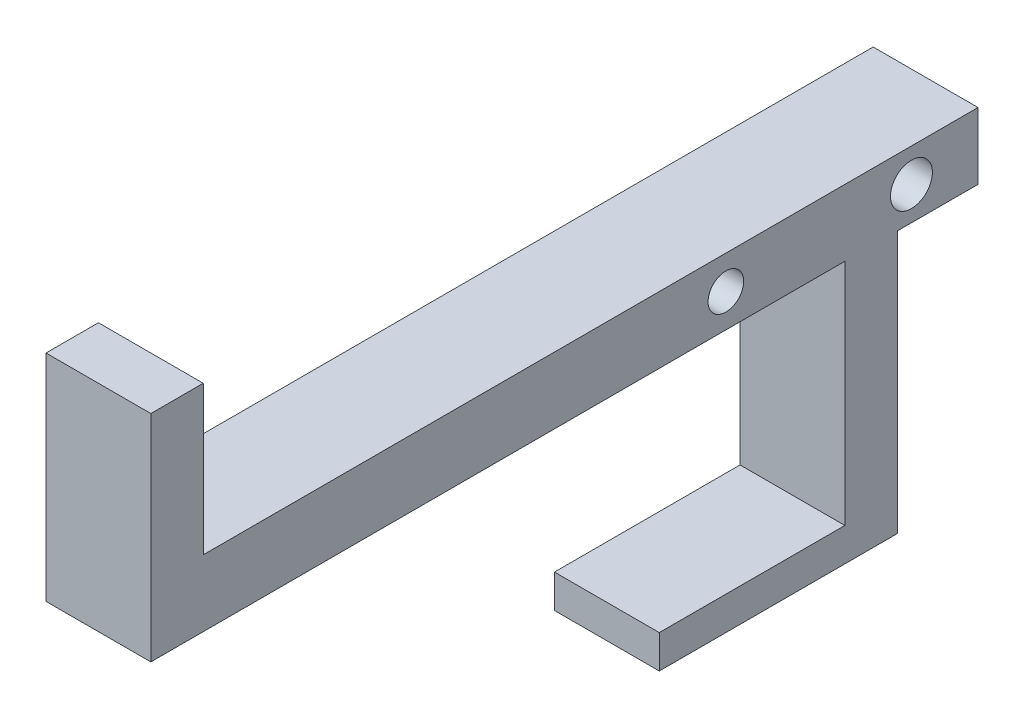
ISO-10303-21;
HEADER;
FILE_DESCRIPTION(('STEP AP214'),'2;1');
FILE_NAME('part.step','',(''),(''),'','','');
FILE_SCHEMA(('AUTOMOTIVE_DESIGN { 1 0 10303 214 1 1 1 1 }'));
ENDSEC;
DATA;
#1=APPLICATION_CONTEXT('core data for automotive mechanical design processes');
#2=APPLICATION_PROTOCOL_DEFINITION('international standard','automotive_design',2000,#1);
#3=PRODUCT_CONTEXT('',#1,'mechanical');
#4=PRODUCT('Part','Part','',(#3));
#5=PRODUCT_RELATED_PRODUCT_CATEGORY('part','',(#4));
#6=PRODUCT_DEFINITION_FORMATION('','',#4);
#7=PRODUCT_DEFINITION_CONTEXT('part definition',#1,'design');
#8=PRODUCT_DEFINITION('design','',#6,#7);
#9=PRODUCT_DEFINITION_SHAPE('','',#8);
#10=(LENGTH_UNIT() NAMED_UNIT(*) SI_UNIT(.MILLI.,.METRE.));
#11=(NAMED_UNIT(*) PLANE_ANGLE_UNIT() SI_UNIT($,.RADIAN.));
#12=(NAMED_UNIT(*) SI_UNIT($,.STERADIAN.) SOLID_ANGLE_UNIT());
#13=UNCERTAINTY_MEASURE_WITH_UNIT(LENGTH_MEASURE(1.E-05),#10,'distance_accuracy_value','');
#14=(GEOMETRIC_REPRESENTATION_CONTEXT(3) GLOBAL_UNCERTAINTY_ASSIGNED_CONTEXT((#13)) GLOBAL_UNIT_ASSIGNED_CONTEXT((#10,
#11,#12)) REPRESENTATION_CONTEXT('',''));
#15=CARTESIAN_POINT('',(0.,0.,0.));
#16=DIRECTION('',(0.,0.,1.));
#17=DIRECTION('',(1.,0.,0.));
#18=AXIS2_PLACEMENT_3D('',#15,#16,#17);
#19=CARTESIAN_POINT('',(10.,0.,-17.7));
#20=DIRECTION('',(0.,0.,-1.));
#21=DIRECTION('',(-1.,0.,0.));
#22=AXIS2_PLACEMENT_3D('',#19,#20,#21);
#23=PLANE('',#22);
#24=DIRECTION('',(0.,-1.,0.));
#25=VECTOR('',#24,1.);
#26=CARTESIAN_POINT('',(0.,0.,-17.7));
#27=LINE('',#26,#25);
#28=CARTESIAN_POINT('',(0.,28.175,-17.7));
#29=VERTEX_POINT('',#28);
#30=CARTESIAN_POINT('',(0.,21.825,-17.7));
#31=VERTEX_POINT('',#30);
#32=EDGE_CURVE('E160',#29,#31,#27,.T.);
#33=ORIENTED_EDGE('',*,*,#32,.F.);
#34=DIRECTION('',(-1.,0.,0.));
#35=VECTOR('',#34,1.);
#36=CARTESIAN_POINT('',(10.,28.175,-17.7));
#37=LINE('',#36,#35);
#38=CARTESIAN_POINT('',(10.,28.175,-17.7));
#39=VERTEX_POINT('',#38);
#40=EDGE_CURVE('E11',#39,#29,#37,.T.);
#41=ORIENTED_EDGE('',*,*,#40,.F.);
#42=DIRECTION('',(0.,-1.,0.));
#43=VECTOR('',#42,1.);
#44=CARTESIAN_POINT('',(10.,0.,-17.7));
#45=LINE('',#44,#43);
#46=CARTESIAN_POINT('',(10.,21.825,-17.7));
#47=VERTEX_POINT('',#46);
#48=EDGE_CURVE('E236',#39,#47,#45,.T.);
#49=ORIENTED_EDGE('',*,*,#48,.T.);
#50=DIRECTION('',(-1.,0.,0.));
#51=VECTOR('',#50,1.);
#52=CARTESIAN_POINT('',(10.,21.825,-17.7));
#53=LINE('',#52,#51);
#54=EDGE_CURVE('E52',#47,#31,#53,.T.);
#55=ORIENTED_EDGE('',*,*,#54,.T.);
#56=EDGE_LOOP('',(#33,#41,#49,#55));
#57=FACE_BOUND('',#56,.T.);
#58=ADVANCED_FACE('F35',(#57),#23,.T.);
#59=CARTESIAN_POINT('',(10.,28.175,0.));
#60=DIRECTION('',(0.,1.,0.));
#61=DIRECTION('',(0.,0.,1.));
#62=AXIS2_PLACEMENT_3D('',#59,#60,#61);
#63=PLANE('',#62);
#64=DIRECTION('',(0.,0.,-1.));
#65=VECTOR('',#64,1.);
#66=CARTESIAN_POINT('',(0.,28.175,0.));
#67=LINE('',#66,#65);
#68=CARTESIAN_POINT('',(0.,28.175,56.2));
#69=VERTEX_POINT('',#68);
#70=EDGE_CURVE('E162',#69,#29,#67,.T.);
#71=ORIENTED_EDGE('',*,*,#70,.F.);
#72=DIRECTION('',(-1.,0.,0.));
#73=VECTOR('',#72,1.);
#74=CARTESIAN_POINT('',(10.,28.175,56.2));
#75=LINE('',#74,#73);
#76=CARTESIAN_POINT('',(10.,28.175,56.2));
#77=VERTEX_POINT('',#76);
#78=EDGE_CURVE('E44',#77,#69,#75,.T.);
#79=ORIENTED_EDGE('',*,*,#78,.F.);
#80=DIRECTION('',(0.,0.,-1.));
#81=VECTOR('',#80,1.);
#82=CARTESIAN_POINT('',(10.,28.175,0.));
#83=LINE('',#82,#81);
#84=EDGE_CURVE('E232',#77,#39,#83,.T.);
#85=ORIENTED_EDGE('',*,*,#84,.T.);
#86=ORIENTED_EDGE('',*,*,#40,.T.);
#87=EDGE_LOOP('',(#71,#79,#85,#86));
#88=FACE_BOUND('',#87,.T.);
#89=ADVANCED_FACE('F220',(#88),#63,.T.);
#90=CARTESIAN_POINT('',(10.,0.,56.2));
#91=DIRECTION('',(0.,0.,-1.));
#92=DIRECTION('',(-1.,0.,0.));
#93=AXIS2_PLACEMENT_3D('',#90,#91,#92);
#94=PLANE('',#93);
#95=DIRECTION('',(0.,-1.,0.));
#96=VECTOR('',#95,1.);
#97=CARTESIAN_POINT('',(0.,0.,56.2));
#98=LINE('',#97,#96);
#99=CARTESIAN_POINT('',(0.,42.3460380599092,56.2));
#100=VERTEX_POINT('',#99);
#101=EDGE_CURVE('E165',#100,#69,#98,.T.);
#102=ORIENTED_EDGE('',*,*,#101,.F.);
#103=DIRECTION('',(-1.,0.,0.));
#104=VECTOR('',#103,1.);
#105=CARTESIAN_POINT('',(10.,42.3460380599092,56.2));
#106=LINE('',#105,#104);
#107=CARTESIAN_POINT('',(10.,42.3460380599092,56.2));
#108=VERTEX_POINT('',#107);
#109=EDGE_CURVE('E209',#108,#100,#106,.T.);
#110=ORIENTED_EDGE('',*,*,#109,.F.);
#111=DIRECTION('',(0.,-1.,0.));
#112=VECTOR('',#111,1.);
#113=CARTESIAN_POINT('',(10.,0.,56.2));
#114=LINE('',#113,#112);
#115=EDGE_CURVE('E216',#108,#77,#114,.T.);
#116=ORIENTED_EDGE('',*,*,#115,.T.);
#117=ORIENTED_EDGE('',*,*,#78,.T.);
#118=EDGE_LOOP('',(#102,#110,#116,#117));
#119=FACE_BOUND('',#118,.T.);
#120=ADVANCED_FACE('F214',(#119),#94,.T.);
#121=CARTESIAN_POINT('',(10.,42.3460380599092,0.));
#122=DIRECTION('',(0.,1.,0.));
#123=DIRECTION('',(0.,0.,1.));
#124=AXIS2_PLACEMENT_3D('',#121,#122,#123);
#125=PLANE('',#124);
#126=DIRECTION('',(0.,0.,-1.));
#127=VECTOR('',#126,1.);
#128=CARTESIAN_POINT('',(0.,42.3460380599092,0.));
#129=LINE('',#128,#127);
#130=CARTESIAN_POINT('',(0.,42.3460380599092,61.2));
#131=VERTEX_POINT('',#130);
#132=EDGE_CURVE('E168',#131,#100,#129,.T.);
#133=ORIENTED_EDGE('',*,*,#132,.F.);
#134=DIRECTION('',(-1.,0.,0.));
#135=VECTOR('',#134,1.);
#136=CARTESIAN_POINT('',(10.,42.3460380599092,61.2));
#137=LINE('',#136,#135);
#138=CARTESIAN_POINT('',(10.,42.3460380599092,61.2));
#139=VERTEX_POINT('',#138);
#140=EDGE_CURVE('E207',#139,#131,#137,.T.);
#141=ORIENTED_EDGE('',*,*,#140,.F.);
#142=DIRECTION('',(0.,0.,-1.));
#143=VECTOR('',#142,1.);
#144=CARTESIAN_POINT('',(10.,42.3460380599092,0.));
#145=LINE('',#144,#143);
#146=EDGE_CURVE('E231',#139,#108,#145,.T.);
#147=ORIENTED_EDGE('',*,*,#146,.T.);
#148=ORIENTED_EDGE('',*,*,#109,.T.);
#149=EDGE_LOOP('',(#133,#141,#147,#148));
#150=FACE_BOUND('',#149,.T.);
#151=ADVANCED_FACE('F227',(#150),#125,.T.);
#152=CARTESIAN_POINT('',(10.,0.,61.2));
#153=DIRECTION('',(0.,0.,-1.));
#154=DIRECTION('',(-1.,0.,0.));
#155=AXIS2_PLACEMENT_3D('',#152,#153,#154);
#156=PLANE('',#155);
#157=DIRECTION('',(0.,-1.,0.));
#158=VECTOR('',#157,1.);
#159=CARTESIAN_POINT('',(0.,0.,61.2));
#160=LINE('',#159,#158);
#161=CARTESIAN_POINT('',(0.,21.825,61.2));
#162=VERTEX_POINT('',#161);
#163=EDGE_CURVE('E171',#131,#162,#160,.T.);
#164=ORIENTED_EDGE('',*,*,#163,.T.);
#165=DIRECTION('',(-1.,0.,0.));
#166=VECTOR('',#165,1.);
#167=CARTESIAN_POINT('',(10.,21.825,61.2));
#168=LINE('',#167,#166);
#169=CARTESIAN_POINT('',(10.,21.825,61.2));
#170=VERTEX_POINT('',#169);
#171=EDGE_CURVE('E205',#170,#162,#168,.T.);
#172=ORIENTED_EDGE('',*,*,#171,.F.);
#173=DIRECTION('',(0.,-1.,0.));
#174=VECTOR('',#173,1.);
#175=CARTESIAN_POINT('',(10.,0.,61.2));
#176=LINE('',#175,#174);
#177=EDGE_CURVE('E234',#139,#170,#176,.T.);
#178=ORIENTED_EDGE('',*,*,#177,.F.);
#179=ORIENTED_EDGE('',*,*,#140,.T.);
#180=EDGE_LOOP('',(#164,#172,#178,#179));
#181=FACE_BOUND('',#180,.T.);
#182=ADVANCED_FACE('F273',(#181),#156,.F.);
#183=CARTESIAN_POINT('',(10.,21.825,0.));
#184=DIRECTION('',(0.,-1.,0.));
#185=DIRECTION('',(0.,0.,-1.));
#186=AXIS2_PLACEMENT_3D('',#183,#184,#185);
#187=PLANE('',#186);
#188=DIRECTION('',(0.,0.,1.));
#189=VECTOR('',#188,1.);
#190=CARTESIAN_POINT('',(0.,21.825,0.));
#191=LINE('',#190,#189);
#192=CARTESIAN_POINT('',(0.,21.825,-5.));
#193=VERTEX_POINT('',#192);
#194=EDGE_CURVE('E174',#193,#162,#191,.T.);
#195=ORIENTED_EDGE('',*,*,#194,.F.);
#196=DIRECTION('',(-1.,0.,0.));
#197=VECTOR('',#196,1.);
#198=CARTESIAN_POINT('',(10.,21.825,-5.));
#199=LINE('',#198,#197);
#200=CARTESIAN_POINT('',(10.,21.825,-5.));
#201=VERTEX_POINT('',#200);
#202=EDGE_CURVE('E203',#201,#193,#199,.T.);
#203=ORIENTED_EDGE('',*,*,#202,.F.);
#204=DIRECTION('',(0.,0.,1.));
#205=VECTOR('',#204,1.);
#206=CARTESIAN_POINT('',(10.,21.825,0.));
#207=LINE('',#206,#205);
#208=EDGE_CURVE('E241',#201,#170,#207,.T.);
#209=ORIENTED_EDGE('',*,*,#208,.T.);
#210=ORIENTED_EDGE('',*,*,#171,.T.);
#211=EDGE_LOOP('',(#195,#203,#209,#210));
#212=FACE_BOUND('',#211,.T.);
#213=ADVANCED_FACE('F276',(#212),#187,.T.);
#214=CARTESIAN_POINT('',(10.,0.,-5.));
#215=DIRECTION('',(0.,0.,-1.));
#216=DIRECTION('',(0.,1.,0.));
#217=AXIS2_PLACEMENT_3D('',#214,#215,#216);
#218=PLANE('',#217);
#219=DIRECTION('',(0.,-1.,0.));
#220=VECTOR('',#219,1.);
#221=CARTESIAN_POINT('',(0.,0.,-5.));
#222=LINE('',#221,#220);
#223=CARTESIAN_POINT('',(0.,0.,-5.));
#224=VERTEX_POINT('',#223);
#225=EDGE_CURVE('E177',#193,#224,#222,.T.);
#226=ORIENTED_EDGE('',*,*,#225,.T.);
#227=DIRECTION('',(-1.,0.,0.));
#228=VECTOR('',#227,1.);
#229=CARTESIAN_POINT('',(10.,0.,-5.));
#230=LINE('',#229,#228);
#231=CARTESIAN_POINT('',(10.,0.,-5.));
#232=VERTEX_POINT('',#231);
#233=EDGE_CURVE('E201',#232,#224,#230,.T.);
#234=ORIENTED_EDGE('',*,*,#233,.F.);
#235=DIRECTION('',(0.,-1.,0.));
#236=VECTOR('',#235,1.);
#237=CARTESIAN_POINT('',(10.,0.,-5.));
#238=LINE('',#237,#236);
#239=EDGE_CURVE('E244',#201,#232,#238,.T.);
#240=ORIENTED_EDGE('',*,*,#239,.F.);
#241=ORIENTED_EDGE('',*,*,#202,.T.);
#242=EDGE_LOOP('',(#226,#234,#240,#241));
#243=FACE_BOUND('',#242,.T.);
#244=ADVANCED_FACE('F280',(#243),#218,.F.);
#245=CARTESIAN_POINT('',(10.,0.,0.));
#246=DIRECTION('',(0.,1.,0.));
#247=DIRECTION('',(0.,0.,1.));
#248=AXIS2_PLACEMENT_3D('',#245,#246,#247);
#249=PLANE('',#248);
#250=DIRECTION('',(0.,0.,-1.));
#251=VECTOR('',#250,1.);
#252=CARTESIAN_POINT('',(0.,0.,0.));
#253=LINE('',#252,#251);
#254=CARTESIAN_POINT('',(0.,0.,12.7));
#255=VERTEX_POINT('',#254);
#256=EDGE_CURVE('E180',#255,#224,#253,.T.);
#257=ORIENTED_EDGE('',*,*,#256,.F.);
#258=DIRECTION('',(-1.,0.,0.));
#259=VECTOR('',#258,1.);
#260=CARTESIAN_POINT('',(10.,0.,12.7));
#261=LINE('',#260,#259);
#262=CARTESIAN_POINT('',(10.,0.,12.7));
#263=VERTEX_POINT('',#262);
#264=EDGE_CURVE('E199',#263,#255,#261,.T.);
#265=ORIENTED_EDGE('',*,*,#264,.F.);
#266=DIRECTION('',(0.,0.,-1.));
#267=VECTOR('',#266,1.);
#268=CARTESIAN_POINT('',(10.,0.,0.));
#269=LINE('',#268,#267);
#270=EDGE_CURVE('E246',#263,#232,#269,.T.);
#271=ORIENTED_EDGE('',*,*,#270,.T.);
#272=ORIENTED_EDGE('',*,*,#233,.T.);
#273=EDGE_LOOP('',(#257,#265,#271,#272));
#274=FACE_BOUND('',#273,.T.);
#275=ADVANCED_FACE('F284',(#274),#249,.T.);
#276=CARTESIAN_POINT('',(10.,0.,12.7));
#277=DIRECTION('',(0.,0.,1.));
#278=DIRECTION('',(1.,0.,0.));
#279=AXIS2_PLACEMENT_3D('',#276,#277,#278);
#280=PLANE('',#279);
#281=DIRECTION('',(0.,1.,0.));
#282=VECTOR('',#281,1.);
#283=CARTESIAN_POINT('',(0.,0.,12.7));
#284=LINE('',#283,#282);
#285=CARTESIAN_POINT('',(0.,-3.175,12.7));
#286=VERTEX_POINT('',#285);
#287=EDGE_CURVE('E183',#286,#255,#284,.T.);
#288=ORIENTED_EDGE('',*,*,#287,.F.);
#289=DIRECTION('',(-1.,0.,0.));
#290=VECTOR('',#289,1.);
#291=CARTESIAN_POINT('',(10.,-3.175,12.7));
#292=LINE('',#291,#290);
#293=CARTESIAN_POINT('',(10.,-3.175,12.7));
#294=VERTEX_POINT('',#293);
#295=EDGE_CURVE('E135',#294,#286,#292,.T.);
#296=ORIENTED_EDGE('',*,*,#295,.F.);
#297=DIRECTION('',(0.,1.,0.));
#298=VECTOR('',#297,1.);
#299=CARTESIAN_POINT('',(10.,0.,12.7));
#300=LINE('',#299,#298);
#301=EDGE_CURVE('E146',#294,#263,#300,.T.);
#302=ORIENTED_EDGE('',*,*,#301,.T.);
#303=ORIENTED_EDGE('',*,*,#264,.T.);
#304=EDGE_LOOP('',(#288,#296,#302,#303));
#305=FACE_BOUND('',#304,.T.);
#306=ADVANCED_FACE('F250',(#305),#280,.T.);
#307=CARTESIAN_POINT('',(10.,-3.175,0.));
#308=DIRECTION('',(0.,-1.,0.));
#309=DIRECTION('',(0.,0.,-1.));
#310=AXIS2_PLACEMENT_3D('',#307,#308,#309);
#311=PLANE('',#310);
#312=DIRECTION('',(0.,0.,1.));
#313=VECTOR('',#312,1.);
#314=CARTESIAN_POINT('',(0.,-3.175,0.));
#315=LINE('',#314,#313);
#316=CARTESIAN_POINT('',(0.,-3.175,-10.));
#317=VERTEX_POINT('',#316);
#318=EDGE_CURVE('E131',#317,#286,#315,.T.);
#319=ORIENTED_EDGE('',*,*,#318,.F.);
#320=DIRECTION('',(-1.,0.,0.));
#321=VECTOR('',#320,1.);
#322=CARTESIAN_POINT('',(10.,-3.175,-10.));
#323=LINE('',#322,#321);
#324=CARTESIAN_POINT('',(10.,-3.175,-10.));
#325=VERTEX_POINT('',#324);
#326=EDGE_CURVE('E126',#325,#317,#323,.T.);
#327=ORIENTED_EDGE('',*,*,#326,.F.);
#328=DIRECTION('',(0.,0.,1.));
#329=VECTOR('',#328,1.);
#330=CARTESIAN_POINT('',(10.,-3.175,0.));
#331=LINE('',#330,#329);
#332=EDGE_CURVE('E129',#325,#294,#331,.T.);
#333=ORIENTED_EDGE('',*,*,#332,.T.);
#334=ORIENTED_EDGE('',*,*,#295,.T.);
#335=EDGE_LOOP('',(#319,#327,#333,#334));
#336=FACE_BOUND('',#335,.T.);
#337=ADVANCED_FACE('F128',(#336),#311,.T.);
#338=CARTESIAN_POINT('',(10.,0.,-10.));
#339=DIRECTION('',(0.,0.,-1.));
#340=DIRECTION('',(0.,1.,0.));
#341=AXIS2_PLACEMENT_3D('',#338,#339,#340);
#342=PLANE('',#341);
#343=DIRECTION('',(0.,-1.,0.));
#344=VECTOR('',#343,1.);
#345=CARTESIAN_POINT('',(0.,0.,-10.));
#346=LINE('',#345,#344);
#347=CARTESIAN_POINT('',(0.,21.825,-10.));
#348=VERTEX_POINT('',#347);
#349=EDGE_CURVE('E187',#348,#317,#346,.T.);
#350=ORIENTED_EDGE('',*,*,#349,.F.);
#351=DIRECTION('',(-1.,0.,0.));
#352=VECTOR('',#351,1.);
#353=CARTESIAN_POINT('',(10.,21.825,-10.));
#354=LINE('',#353,#352);
#355=CARTESIAN_POINT('',(10.,21.825,-10.));
#356=VERTEX_POINT('',#355);
#357=EDGE_CURVE('E89',#356,#348,#354,.T.);
#358=ORIENTED_EDGE('',*,*,#357,.F.);
#359=DIRECTION('',(0.,-1.,0.));
#360=VECTOR('',#359,1.);
#361=CARTESIAN_POINT('',(10.,0.,-10.));
#362=LINE('',#361,#360);
#363=EDGE_CURVE('E143',#356,#325,#362,.T.);
#364=ORIENTED_EDGE('',*,*,#363,.T.);
#365=ORIENTED_EDGE('',*,*,#326,.T.);
#366=EDGE_LOOP('',(#350,#358,#364,#365));
#367=FACE_BOUND('',#366,.T.);
#368=ADVANCED_FACE('F148',(#367),#342,.T.);
#369=CARTESIAN_POINT('',(10.,21.825,0.));
#370=DIRECTION('',(0.,-1.,0.));
#371=DIRECTION('',(0.,0.,-1.));
#372=AXIS2_PLACEMENT_3D('',#369,#370,#371);
#373=PLANE('',#372);
#374=DIRECTION('',(0.,0.,1.));
#375=VECTOR('',#374,1.);
#376=CARTESIAN_POINT('',(0.,21.825,0.));
#377=LINE('',#376,#375);
#378=EDGE_CURVE('E189',#31,#348,#377,.T.);
#379=ORIENTED_EDGE('',*,*,#378,.F.);
#380=ORIENTED_EDGE('',*,*,#54,.F.);
#381=DIRECTION('',(0.,0.,1.));
#382=VECTOR('',#381,1.);
#383=CARTESIAN_POINT('',(10.,21.825,0.));
#384=LINE('',#383,#382);
#385=EDGE_CURVE('E149',#47,#356,#384,.T.);
#386=ORIENTED_EDGE('',*,*,#385,.T.);
#387=ORIENTED_EDGE('',*,*,#357,.T.);
#388=EDGE_LOOP('',(#379,#380,#386,#387));
#389=FACE_BOUND('',#388,.T.);
#390=ADVANCED_FACE('F252',(#389),#373,.T.);
#391=CARTESIAN_POINT('',(10.,25.,-11.35));
#392=DIRECTION('',(-1.,0.,0.));
#393=DIRECTION('',(0.,0.,1.));
#394=AXIS2_PLACEMENT_3D('',#391,#392,#393);
#395=CYLINDRICAL_SURFACE('',#394,2.);
#396=CARTESIAN_POINT('',(10.,25.,-11.35));
#397=DIRECTION('',(1.,0.,0.));
#398=DIRECTION('',(0.,0.,-1.));
#399=AXIS2_PLACEMENT_3D('',#396,#397,#398);
#400=CIRCLE('',#399,2.);
#401=CARTESIAN_POINT('',(10.,25.,-13.35));
#402=VERTEX_POINT('',#401);
#403=EDGE_CURVE('E195',#402,#402,#400,.T.);
#404=ORIENTED_EDGE('',*,*,#403,.T.);
#405=EDGE_LOOP('',(#404));
#406=FACE_BOUND('',#405,.T.);
#407=CARTESIAN_POINT('',(0.,25.,-11.35));
#408=DIRECTION('',(1.,0.,0.));
#409=DIRECTION('',(0.,0.,-1.));
#410=AXIS2_PLACEMENT_3D('',#407,#408,#409);
#411=CIRCLE('',#410,2.);
#412=CARTESIAN_POINT('',(0.,25.,-13.35));
#413=VERTEX_POINT('',#412);
#414=EDGE_CURVE('E157',#413,#413,#411,.T.);
#415=ORIENTED_EDGE('',*,*,#414,.F.);
#416=EDGE_LOOP('',(#415));
#417=FACE_BOUND('',#416,.T.);
#418=ADVANCED_FACE('F37',(#406,#417),#395,.F.);
#419=CARTESIAN_POINT('',(10.,25.,6.35));
#420=DIRECTION('',(-1.,0.,0.));
#421=DIRECTION('',(0.,0.,1.));
#422=AXIS2_PLACEMENT_3D('',#419,#420,#421);
#423=CYLINDRICAL_SURFACE('',#422,1.7);
#424=CARTESIAN_POINT('',(10.,25.,6.35));
#425=DIRECTION('',(1.,0.,0.));
#426=DIRECTION('',(0.,0.,-1.));
#427=AXIS2_PLACEMENT_3D('',#424,#425,#426);
#428=CIRCLE('',#427,1.7);
#429=CARTESIAN_POINT('',(10.,25.,4.65));
#430=VERTEX_POINT('',#429);
#431=EDGE_CURVE('E151',#430,#430,#428,.T.);
#432=ORIENTED_EDGE('',*,*,#431,.T.);
#433=EDGE_LOOP('',(#432));
#434=FACE_BOUND('',#433,.T.);
#435=CARTESIAN_POINT('',(0.,25.,6.35));
#436=DIRECTION('',(1.,0.,0.));
#437=DIRECTION('',(0.,0.,-1.));
#438=AXIS2_PLACEMENT_3D('',#435,#436,#437);
#439=CIRCLE('',#438,1.7);
#440=CARTESIAN_POINT('',(0.,25.,4.65));
#441=VERTEX_POINT('',#440);
#442=EDGE_CURVE('E192',#441,#441,#439,.T.);
#443=ORIENTED_EDGE('',*,*,#442,.F.);
#444=EDGE_LOOP('',(#443));
#445=FACE_BOUND('',#444,.T.);
#446=ADVANCED_FACE('F259',(#434,#445),#423,.F.);
#447=CARTESIAN_POINT('',(10.,0.,0.));
#448=DIRECTION('',(1.,0.,0.));
#449=DIRECTION('',(0.,0.,-1.));
#450=AXIS2_PLACEMENT_3D('',#447,#448,#449);
#451=PLANE('',#450);
#452=ORIENTED_EDGE('',*,*,#403,.F.);
#453=EDGE_LOOP('',(#452));
#454=FACE_BOUND('',#453,.T.);
#455=ORIENTED_EDGE('',*,*,#48,.F.);
#456=ORIENTED_EDGE('',*,*,#84,.F.);
#457=ORIENTED_EDGE('',*,*,#115,.F.);
#458=ORIENTED_EDGE('',*,*,#146,.F.);
#459=ORIENTED_EDGE('',*,*,#177,.T.);
#460=ORIENTED_EDGE('',*,*,#208,.F.);
#461=ORIENTED_EDGE('',*,*,#239,.T.);
#462=ORIENTED_EDGE('',*,*,#270,.F.);
#463=ORIENTED_EDGE('',*,*,#301,.F.);
#464=ORIENTED_EDGE('',*,*,#332,.F.);
#465=ORIENTED_EDGE('',*,*,#363,.F.);
#466=ORIENTED_EDGE('',*,*,#385,.F.);
#467=EDGE_LOOP('',(#455,#456,#457,#458,#459,#460,#461,#462,#463,#464,#465,#466));
#468=FACE_BOUND('',#467,.T.);
#469=ORIENTED_EDGE('',*,*,#431,.F.);
#470=EDGE_LOOP('',(#469));
#471=FACE_BOUND('',#470,.T.);
#472=ADVANCED_FACE('F140',(#454,#468,#471),#451,.T.);
#473=CARTESIAN_POINT('',(0.,0.,0.));
#474=DIRECTION('',(1.,0.,0.));
#475=DIRECTION('',(0.,0.,-1.));
#476=AXIS2_PLACEMENT_3D('',#473,#474,#475);
#477=PLANE('',#476);
#478=ORIENTED_EDGE('',*,*,#414,.T.);
#479=EDGE_LOOP('',(#478));
#480=FACE_BOUND('',#479,.T.);
#481=ORIENTED_EDGE('',*,*,#32,.T.);
#482=ORIENTED_EDGE('',*,*,#378,.T.);
#483=ORIENTED_EDGE('',*,*,#349,.T.);
#484=ORIENTED_EDGE('',*,*,#318,.T.);
#485=ORIENTED_EDGE('',*,*,#287,.T.);
#486=ORIENTED_EDGE('',*,*,#256,.T.);
#487=ORIENTED_EDGE('',*,*,#225,.F.);
#488=ORIENTED_EDGE('',*,*,#194,.T.);
#489=ORIENTED_EDGE('',*,*,#163,.F.);
#490=ORIENTED_EDGE('',*,*,#132,.T.);
#491=ORIENTED_EDGE('',*,*,#101,.T.);
#492=ORIENTED_EDGE('',*,*,#70,.T.);
#493=EDGE_LOOP('',(#481,#482,#483,#484,#485,#486,#487,#488,#489,#490,#491,#492));
#494=FACE_BOUND('',#493,.T.);
#495=ORIENTED_EDGE('',*,*,#442,.T.);
#496=EDGE_LOOP('',(#495));
#497=FACE_BOUND('',#496,.T.);
#498=ADVANCED_FACE('F222',(#480,#494,#497),#477,.F.);
#499=CLOSED_SHELL('',(#58,#89,#120,#151,#182,#213,#244,#275,#306,#337,#368,#390,#418,#446,#472,#498));
#500=MANIFOLD_SOLID_BREP('B2',#499);
#501=ADVANCED_BREP_SHAPE_REPRESENTATION('',(#18,#500),#14);
#502=SHAPE_DEFINITION_REPRESENTATION(#9,#501);
ENDSEC;
END-ISO-10303-21;
